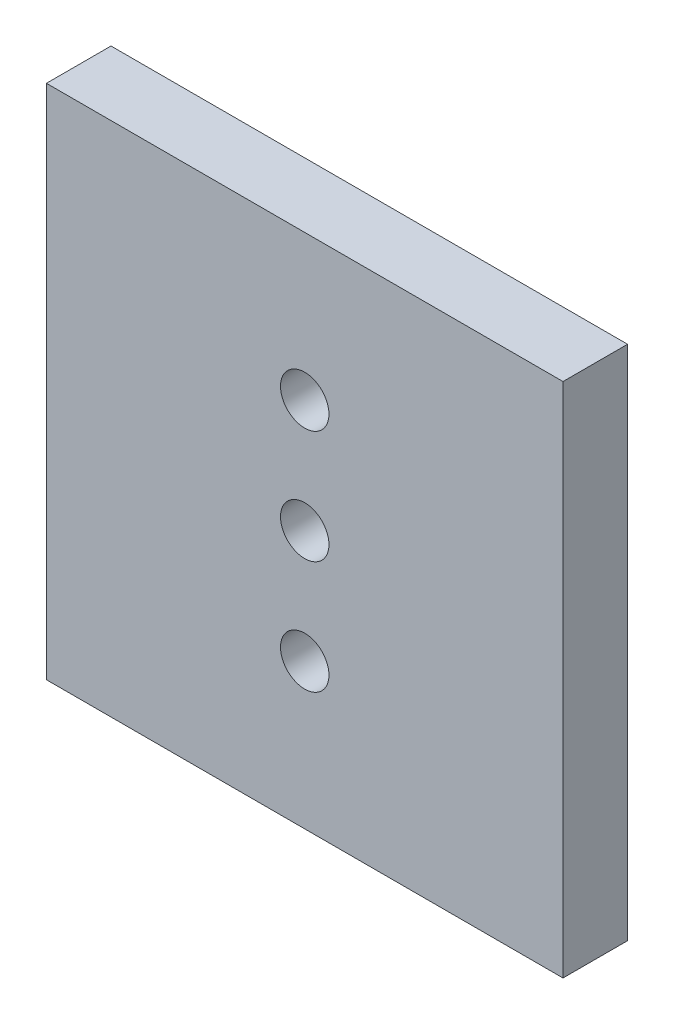
ISO-10303-21;
HEADER;
FILE_DESCRIPTION(('STEP AP214'),'2;1');
FILE_NAME('part.step','',(''),(''),'','','');
FILE_SCHEMA(('AUTOMOTIVE_DESIGN { 1 0 10303 214 1 1 1 1 }'));
ENDSEC;
DATA;
#1=APPLICATION_CONTEXT('core data for automotive mechanical design processes');
#2=APPLICATION_PROTOCOL_DEFINITION('international standard','automotive_design',2000,#1);
#3=PRODUCT_CONTEXT('',#1,'mechanical');
#4=PRODUCT('Part','Part','',(#3));
#5=PRODUCT_RELATED_PRODUCT_CATEGORY('part','',(#4));
#6=PRODUCT_DEFINITION_FORMATION('','',#4);
#7=PRODUCT_DEFINITION_CONTEXT('part definition',#1,'design');
#8=PRODUCT_DEFINITION('design','',#6,#7);
#9=PRODUCT_DEFINITION_SHAPE('','',#8);
#10=(LENGTH_UNIT() NAMED_UNIT(*) SI_UNIT(.MILLI.,.METRE.));
#11=(NAMED_UNIT(*) PLANE_ANGLE_UNIT() SI_UNIT($,.RADIAN.));
#12=(NAMED_UNIT(*) SI_UNIT($,.STERADIAN.) SOLID_ANGLE_UNIT());
#13=UNCERTAINTY_MEASURE_WITH_UNIT(LENGTH_MEASURE(1.E-05),#10,'distance_accuracy_value','');
#14=(GEOMETRIC_REPRESENTATION_CONTEXT(3) GLOBAL_UNCERTAINTY_ASSIGNED_CONTEXT((#13)) GLOBAL_UNIT_ASSIGNED_CONTEXT((#10,
#11,#12)) REPRESENTATION_CONTEXT('',''));
#15=CARTESIAN_POINT('',(0.,0.,0.));
#16=DIRECTION('',(0.,0.,1.));
#17=DIRECTION('',(1.,0.,0.));
#18=AXIS2_PLACEMENT_3D('',#15,#16,#17);
#19=CARTESIAN_POINT('',(268.,268.,308.));
#20=DIRECTION('',(1.,0.,0.));
#21=DIRECTION('',(0.,0.,-1.));
#22=AXIS2_PLACEMENT_3D('',#19,#20,#21);
#23=PLANE('',#22);
#24=DIRECTION('',(0.,-1.,0.));
#25=VECTOR('',#24,1.);
#26=CARTESIAN_POINT('',(268.,268.,300.));
#27=LINE('',#26,#25);
#28=CARTESIAN_POINT('',(268.,332.,300.));
#29=VERTEX_POINT('',#28);
#30=CARTESIAN_POINT('',(268.,268.,300.));
#31=VERTEX_POINT('',#30);
#32=EDGE_CURVE('E104',#29,#31,#27,.T.);
#33=ORIENTED_EDGE('',*,*,#32,.T.);
#34=DIRECTION('',(0.,0.,-1.));
#35=VECTOR('',#34,1.);
#36=CARTESIAN_POINT('',(268.,268.,308.));
#37=LINE('',#36,#35);
#38=CARTESIAN_POINT('',(268.,268.,308.));
#39=VERTEX_POINT('',#38);
#40=EDGE_CURVE('E11',#39,#31,#37,.T.);
#41=ORIENTED_EDGE('',*,*,#40,.F.);
#42=DIRECTION('',(0.,-1.,0.));
#43=VECTOR('',#42,1.);
#44=CARTESIAN_POINT('',(268.,268.,308.));
#45=LINE('',#44,#43);
#46=CARTESIAN_POINT('',(268.,332.,308.));
#47=VERTEX_POINT('',#46);
#48=EDGE_CURVE('E95',#47,#39,#45,.T.);
#49=ORIENTED_EDGE('',*,*,#48,.F.);
#50=DIRECTION('',(0.,0.,-1.));
#51=VECTOR('',#50,1.);
#52=CARTESIAN_POINT('',(268.,332.,308.));
#53=LINE('',#52,#51);
#54=EDGE_CURVE('E101',#47,#29,#53,.T.);
#55=ORIENTED_EDGE('',*,*,#54,.T.);
#56=EDGE_LOOP('',(#33,#41,#49,#55));
#57=FACE_BOUND('',#56,.T.);
#58=ADVANCED_FACE('F39',(#57),#23,.F.);
#59=CARTESIAN_POINT('',(268.,268.,308.));
#60=DIRECTION('',(0.,1.,0.));
#61=DIRECTION('',(0.,0.,1.));
#62=AXIS2_PLACEMENT_3D('',#59,#60,#61);
#63=PLANE('',#62);
#64=DIRECTION('',(1.,0.,0.));
#65=VECTOR('',#64,1.);
#66=CARTESIAN_POINT('',(268.,268.,300.));
#67=LINE('',#66,#65);
#68=CARTESIAN_POINT('',(332.,268.,300.));
#69=VERTEX_POINT('',#68);
#70=EDGE_CURVE('E96',#31,#69,#67,.T.);
#71=ORIENTED_EDGE('',*,*,#70,.T.);
#72=DIRECTION('',(0.,0.,-1.));
#73=VECTOR('',#72,1.);
#74=CARTESIAN_POINT('',(332.,268.,308.));
#75=LINE('',#74,#73);
#76=CARTESIAN_POINT('',(332.,268.,308.));
#77=VERTEX_POINT('',#76);
#78=EDGE_CURVE('E48',#77,#69,#75,.T.);
#79=ORIENTED_EDGE('',*,*,#78,.F.);
#80=DIRECTION('',(1.,0.,0.));
#81=VECTOR('',#80,1.);
#82=CARTESIAN_POINT('',(268.,268.,308.));
#83=LINE('',#82,#81);
#84=EDGE_CURVE('E87',#39,#77,#83,.T.);
#85=ORIENTED_EDGE('',*,*,#84,.F.);
#86=ORIENTED_EDGE('',*,*,#40,.T.);
#87=EDGE_LOOP('',(#71,#79,#85,#86));
#88=FACE_BOUND('',#87,.T.);
#89=ADVANCED_FACE('F92',(#88),#63,.F.);
#90=CARTESIAN_POINT('',(332.,268.,308.));
#91=DIRECTION('',(-1.,0.,0.));
#92=DIRECTION('',(0.,0.,1.));
#93=AXIS2_PLACEMENT_3D('',#90,#91,#92);
#94=PLANE('',#93);
#95=DIRECTION('',(0.,1.,0.));
#96=VECTOR('',#95,1.);
#97=CARTESIAN_POINT('',(332.,268.,300.));
#98=LINE('',#97,#96);
#99=CARTESIAN_POINT('',(332.,332.,300.));
#100=VERTEX_POINT('',#99);
#101=EDGE_CURVE('E74',#69,#100,#98,.T.);
#102=ORIENTED_EDGE('',*,*,#101,.T.);
#103=DIRECTION('',(0.,0.,-1.));
#104=VECTOR('',#103,1.);
#105=CARTESIAN_POINT('',(332.,332.,308.));
#106=LINE('',#105,#104);
#107=CARTESIAN_POINT('',(332.,332.,308.));
#108=VERTEX_POINT('',#107);
#109=EDGE_CURVE('E100',#108,#100,#106,.T.);
#110=ORIENTED_EDGE('',*,*,#109,.F.);
#111=DIRECTION('',(0.,1.,0.));
#112=VECTOR('',#111,1.);
#113=CARTESIAN_POINT('',(332.,268.,308.));
#114=LINE('',#113,#112);
#115=EDGE_CURVE('E89',#77,#108,#114,.T.);
#116=ORIENTED_EDGE('',*,*,#115,.F.);
#117=ORIENTED_EDGE('',*,*,#78,.T.);
#118=EDGE_LOOP('',(#102,#110,#116,#117));
#119=FACE_BOUND('',#118,.T.);
#120=ADVANCED_FACE('F97',(#119),#94,.F.);
#121=CARTESIAN_POINT('',(268.,332.,308.));
#122=DIRECTION('',(0.,-1.,0.));
#123=DIRECTION('',(0.,0.,-1.));
#124=AXIS2_PLACEMENT_3D('',#121,#122,#123);
#125=PLANE('',#124);
#126=DIRECTION('',(-1.,0.,0.));
#127=VECTOR('',#126,1.);
#128=CARTESIAN_POINT('',(268.,332.,300.));
#129=LINE('',#128,#127);
#130=EDGE_CURVE('E78',#100,#29,#129,.T.);
#131=ORIENTED_EDGE('',*,*,#130,.T.);
#132=ORIENTED_EDGE('',*,*,#54,.F.);
#133=DIRECTION('',(-1.,0.,0.));
#134=VECTOR('',#133,1.);
#135=CARTESIAN_POINT('',(268.,332.,308.));
#136=LINE('',#135,#134);
#137=EDGE_CURVE('E60',#108,#47,#136,.T.);
#138=ORIENTED_EDGE('',*,*,#137,.F.);
#139=ORIENTED_EDGE('',*,*,#109,.T.);
#140=EDGE_LOOP('',(#131,#132,#138,#139));
#141=FACE_BOUND('',#140,.T.);
#142=ADVANCED_FACE('F137',(#141),#125,.F.);
#143=CARTESIAN_POINT('',(0.,0.,308.));
#144=DIRECTION('',(0.,0.,-1.));
#145=DIRECTION('',(-1.,0.,0.));
#146=AXIS2_PLACEMENT_3D('',#143,#144,#145);
#147=PLANE('',#146);
#148=CARTESIAN_POINT('',(300.,286.,308.));
#149=DIRECTION('',(0.,0.,1.));
#150=DIRECTION('',(1.,0.,0.));
#151=AXIS2_PLACEMENT_3D('',#148,#149,#150);
#152=CIRCLE('',#151,2.99999999999999);
#153=CARTESIAN_POINT('',(303.,286.,308.));
#154=VERTEX_POINT('',#153);
#155=EDGE_CURVE('E126',#154,#154,#152,.T.);
#156=ORIENTED_EDGE('',*,*,#155,.F.);
#157=EDGE_LOOP('',(#156));
#158=FACE_BOUND('',#157,.T.);
#159=CARTESIAN_POINT('',(300.,314.,308.));
#160=DIRECTION('',(0.,0.,1.));
#161=DIRECTION('',(1.,0.,0.));
#162=AXIS2_PLACEMENT_3D('',#159,#160,#161);
#163=CIRCLE('',#162,2.99999999999999);
#164=CARTESIAN_POINT('',(303.,314.,308.));
#165=VERTEX_POINT('',#164);
#166=EDGE_CURVE('E119',#165,#165,#163,.T.);
#167=ORIENTED_EDGE('',*,*,#166,.F.);
#168=EDGE_LOOP('',(#167));
#169=FACE_BOUND('',#168,.T.);
#170=CARTESIAN_POINT('',(300.,300.,308.));
#171=DIRECTION('',(0.,0.,1.));
#172=DIRECTION('',(1.,0.,0.));
#173=AXIS2_PLACEMENT_3D('',#170,#171,#172);
#174=CIRCLE('',#173,2.99999999999999);
#175=CARTESIAN_POINT('',(303.,300.,308.));
#176=VERTEX_POINT('',#175);
#177=EDGE_CURVE('E113',#176,#176,#174,.T.);
#178=ORIENTED_EDGE('',*,*,#177,.F.);
#179=EDGE_LOOP('',(#178));
#180=FACE_BOUND('',#179,.T.);
#181=ORIENTED_EDGE('',*,*,#48,.T.);
#182=ORIENTED_EDGE('',*,*,#84,.T.);
#183=ORIENTED_EDGE('',*,*,#115,.T.);
#184=ORIENTED_EDGE('',*,*,#137,.T.);
#185=EDGE_LOOP('',(#181,#182,#183,#184));
#186=FACE_BOUND('',#185,.T.);
#187=ADVANCED_FACE('F86',(#158,#169,#180,#186),#147,.F.);
#188=CARTESIAN_POINT('',(0.,0.,300.));
#189=DIRECTION('',(0.,0.,-1.));
#190=DIRECTION('',(-1.,0.,0.));
#191=AXIS2_PLACEMENT_3D('',#188,#189,#190);
#192=PLANE('',#191);
#193=CARTESIAN_POINT('',(300.,286.,300.));
#194=DIRECTION('',(0.,0.,-1.));
#195=DIRECTION('',(-1.,0.,0.));
#196=AXIS2_PLACEMENT_3D('',#193,#194,#195);
#197=CIRCLE('',#196,2.99999999999999);
#198=CARTESIAN_POINT('',(297.,286.,300.));
#199=VERTEX_POINT('',#198);
#200=EDGE_CURVE('E45',#199,#199,#197,.T.);
#201=ORIENTED_EDGE('',*,*,#200,.F.);
#202=EDGE_LOOP('',(#201));
#203=FACE_BOUND('',#202,.T.);
#204=CARTESIAN_POINT('',(300.,314.,300.));
#205=DIRECTION('',(0.,0.,-1.));
#206=DIRECTION('',(-1.,0.,0.));
#207=AXIS2_PLACEMENT_3D('',#204,#205,#206);
#208=CIRCLE('',#207,2.99999999999999);
#209=CARTESIAN_POINT('',(297.,314.,300.));
#210=VERTEX_POINT('',#209);
#211=EDGE_CURVE('E117',#210,#210,#208,.T.);
#212=ORIENTED_EDGE('',*,*,#211,.F.);
#213=EDGE_LOOP('',(#212));
#214=FACE_BOUND('',#213,.T.);
#215=CARTESIAN_POINT('',(300.,300.,300.));
#216=DIRECTION('',(0.,0.,-1.));
#217=DIRECTION('',(-1.,0.,0.));
#218=AXIS2_PLACEMENT_3D('',#215,#216,#217);
#219=CIRCLE('',#218,2.99999999999999);
#220=CARTESIAN_POINT('',(297.,300.,300.));
#221=VERTEX_POINT('',#220);
#222=EDGE_CURVE('E107',#221,#221,#219,.T.);
#223=ORIENTED_EDGE('',*,*,#222,.F.);
#224=EDGE_LOOP('',(#223));
#225=FACE_BOUND('',#224,.T.);
#226=ORIENTED_EDGE('',*,*,#32,.F.);
#227=ORIENTED_EDGE('',*,*,#130,.F.);
#228=ORIENTED_EDGE('',*,*,#101,.F.);
#229=ORIENTED_EDGE('',*,*,#70,.F.);
#230=EDGE_LOOP('',(#226,#227,#228,#229));
#231=FACE_BOUND('',#230,.T.);
#232=ADVANCED_FACE('F139',(#203,#214,#225,#231),#192,.T.);
#233=CARTESIAN_POINT('',(300.,300.,280.));
#234=DIRECTION('',(0.,0.,1.));
#235=DIRECTION('',(1.,0.,0.));
#236=AXIS2_PLACEMENT_3D('',#233,#234,#235);
#237=CYLINDRICAL_SURFACE('',#236,2.99999999999999);
#238=ORIENTED_EDGE('',*,*,#222,.T.);
#239=EDGE_LOOP('',(#238));
#240=FACE_BOUND('',#239,.T.);
#241=ORIENTED_EDGE('',*,*,#177,.T.);
#242=EDGE_LOOP('',(#241));
#243=FACE_BOUND('',#242,.T.);
#244=ADVANCED_FACE('F141',(#240,#243),#237,.F.);
#245=CARTESIAN_POINT('',(300.,314.,280.));
#246=DIRECTION('',(0.,0.,1.));
#247=DIRECTION('',(1.,0.,0.));
#248=AXIS2_PLACEMENT_3D('',#245,#246,#247);
#249=CYLINDRICAL_SURFACE('',#248,2.99999999999999);
#250=ORIENTED_EDGE('',*,*,#211,.T.);
#251=EDGE_LOOP('',(#250));
#252=FACE_BOUND('',#251,.T.);
#253=ORIENTED_EDGE('',*,*,#166,.T.);
#254=EDGE_LOOP('',(#253));
#255=FACE_BOUND('',#254,.T.);
#256=ADVANCED_FACE('F144',(#252,#255),#249,.F.);
#257=CARTESIAN_POINT('',(300.,286.,280.));
#258=DIRECTION('',(0.,0.,1.));
#259=DIRECTION('',(1.,0.,0.));
#260=AXIS2_PLACEMENT_3D('',#257,#258,#259);
#261=CYLINDRICAL_SURFACE('',#260,2.99999999999999);
#262=ORIENTED_EDGE('',*,*,#200,.T.);
#263=EDGE_LOOP('',(#262));
#264=FACE_BOUND('',#263,.T.);
#265=ORIENTED_EDGE('',*,*,#155,.T.);
#266=EDGE_LOOP('',(#265));
#267=FACE_BOUND('',#266,.T.);
#268=ADVANCED_FACE('F134',(#264,#267),#261,.F.);
#269=CLOSED_SHELL('',(#58,#89,#120,#142,#187,#232,#244,#256,#268));
#270=MANIFOLD_SOLID_BREP('B2',#269);
#271=ADVANCED_BREP_SHAPE_REPRESENTATION('',(#18,#270),#14);
#272=SHAPE_DEFINITION_REPRESENTATION(#9,#271);
ENDSEC;
END-ISO-10303-21;
